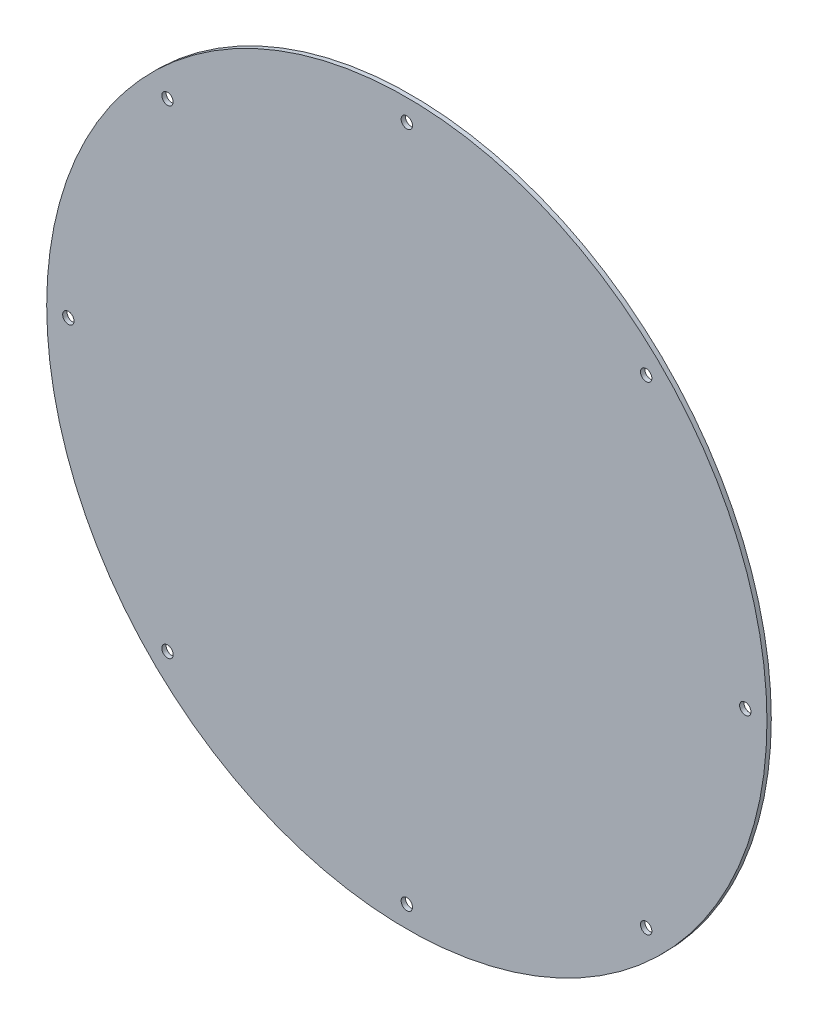
ISO-10303-21;
HEADER;
FILE_DESCRIPTION(('STEP AP214'),'2;1');
FILE_NAME('part.step','',(''),(''),'','','');
FILE_SCHEMA(('AUTOMOTIVE_DESIGN { 1 0 10303 214 1 1 1 1 }'));
ENDSEC;
DATA;
#1=APPLICATION_CONTEXT('core data for automotive mechanical design processes');
#2=APPLICATION_PROTOCOL_DEFINITION('international standard','automotive_design',2000,#1);
#3=PRODUCT_CONTEXT('',#1,'mechanical');
#4=PRODUCT('Part','Part','',(#3));
#5=PRODUCT_RELATED_PRODUCT_CATEGORY('part','',(#4));
#6=PRODUCT_DEFINITION_FORMATION('','',#4);
#7=PRODUCT_DEFINITION_CONTEXT('part definition',#1,'design');
#8=PRODUCT_DEFINITION('design','',#6,#7);
#9=PRODUCT_DEFINITION_SHAPE('','',#8);
#10=(LENGTH_UNIT() NAMED_UNIT(*) SI_UNIT(.MILLI.,.METRE.));
#11=(NAMED_UNIT(*) PLANE_ANGLE_UNIT() SI_UNIT($,.RADIAN.));
#12=(NAMED_UNIT(*) SI_UNIT($,.STERADIAN.) SOLID_ANGLE_UNIT());
#13=UNCERTAINTY_MEASURE_WITH_UNIT(LENGTH_MEASURE(1.E-05),#10,'distance_accuracy_value','');
#14=(GEOMETRIC_REPRESENTATION_CONTEXT(3) GLOBAL_UNCERTAINTY_ASSIGNED_CONTEXT((#13)) GLOBAL_UNIT_ASSIGNED_CONTEXT((#10,
#11,#12)) REPRESENTATION_CONTEXT('',''));
#15=CARTESIAN_POINT('',(0.,0.,0.));
#16=DIRECTION('',(0.,0.,1.));
#17=DIRECTION('',(1.,0.,0.));
#18=AXIS2_PLACEMENT_3D('',#15,#16,#17);
#19=CARTESIAN_POINT('',(0.,0.,1.6));
#20=DIRECTION('',(0.,0.,1.));
#21=DIRECTION('',(1.,0.,0.));
#22=AXIS2_PLACEMENT_3D('',#19,#20,#21);
#23=PLANE('',#22);
#24=CARTESIAN_POINT('',(-124.999999999991,-9.3819195673314E-12,1.6));
#25=DIRECTION('',(0.,0.,1.));
#26=DIRECTION('',(1.,0.,0.));
#27=AXIS2_PLACEMENT_3D('',#24,#25,#26);
#28=CIRCLE('',#27,2.1000000000128);
#29=CARTESIAN_POINT('',(-122.899999999978,-9.3819195673314E-12,1.6));
#30=VERTEX_POINT('',#29);
#31=EDGE_CURVE('E80',#30,#30,#28,.T.);
#32=ORIENTED_EDGE('',*,*,#31,.F.);
#33=EDGE_LOOP('',(#32));
#34=FACE_BOUND('',#33,.T.);
#35=CARTESIAN_POINT('',(1.87332229646841E-11,-125.,1.6));
#36=DIRECTION('',(0.,0.,1.));
#37=DIRECTION('',(1.,0.,0.));
#38=AXIS2_PLACEMENT_3D('',#35,#36,#37);
#39=CIRCLE('',#38,2.1000000000128);
#40=CARTESIAN_POINT('',(2.10000000003154,-125.,1.6));
#41=VERTEX_POINT('',#40);
#42=EDGE_CURVE('E68',#41,#41,#39,.T.);
#43=ORIENTED_EDGE('',*,*,#42,.F.);
#44=EDGE_LOOP('',(#43));
#45=FACE_BOUND('',#44,.T.);
#46=CARTESIAN_POINT('',(125.000000000009,9.36661148234206E-12,1.6));
#47=DIRECTION('',(0.,0.,1.));
#48=DIRECTION('',(1.,0.,0.));
#49=AXIS2_PLACEMENT_3D('',#46,#47,#48);
#50=CIRCLE('',#49,2.10000000001282);
#51=CARTESIAN_POINT('',(127.100000000022,9.36661148234206E-12,1.6));
#52=VERTEX_POINT('',#51);
#53=EDGE_CURVE('E56',#52,#52,#50,.T.);
#54=ORIENTED_EDGE('',*,*,#53,.F.);
#55=EDGE_LOOP('',(#54));
#56=FACE_BOUND('',#55,.T.);
#57=CARTESIAN_POINT('',(0.,125.,1.6));
#58=DIRECTION('',(0.,0.,1.));
#59=DIRECTION('',(1.,0.,0.));
#60=AXIS2_PLACEMENT_3D('',#57,#58,#59);
#61=CIRCLE('',#60,2.1000000000128);
#62=CARTESIAN_POINT('',(2.1000000000128,125.,1.6));
#63=VERTEX_POINT('',#62);
#64=EDGE_CURVE('E45',#63,#63,#61,.T.);
#65=ORIENTED_EDGE('',*,*,#64,.F.);
#66=EDGE_LOOP('',(#65));
#67=FACE_BOUND('',#66,.T.);
#68=CARTESIAN_POINT('',(0.,0.,1.6));
#69=DIRECTION('',(0.,0.,1.));
#70=DIRECTION('',(1.,0.,0.));
#71=AXIS2_PLACEMENT_3D('',#68,#69,#70);
#72=CIRCLE('',#71,133.);
#73=CARTESIAN_POINT('',(133.,0.,1.6));
#74=VERTEX_POINT('',#73);
#75=EDGE_CURVE('E10',#74,#74,#72,.T.);
#76=ORIENTED_EDGE('',*,*,#75,.T.);
#77=EDGE_LOOP('',(#76));
#78=FACE_BOUND('',#77,.T.);
#79=CARTESIAN_POINT('',(88.3883476483212,88.3883476483251,1.6));
#80=DIRECTION('',(0.,0.,1.));
#81=DIRECTION('',(1.,0.,0.));
#82=AXIS2_PLACEMENT_3D('',#79,#80,#81);
#83=CIRCLE('',#82,2.1000000000128);
#84=CARTESIAN_POINT('',(90.488347648334,88.3883476483251,1.6));
#85=VERTEX_POINT('',#84);
#86=EDGE_CURVE('E50',#85,#85,#83,.T.);
#87=ORIENTED_EDGE('',*,*,#86,.F.);
#88=EDGE_LOOP('',(#87));
#89=FACE_BOUND('',#88,.T.);
#90=CARTESIAN_POINT('',(88.3883476483344,-88.3883476483118,1.6));
#91=DIRECTION('',(0.,0.,1.));
#92=DIRECTION('',(1.,0.,0.));
#93=AXIS2_PLACEMENT_3D('',#90,#91,#92);
#94=CIRCLE('',#93,2.1000000000128);
#95=CARTESIAN_POINT('',(90.4883476483472,-88.3883476483118,1.6));
#96=VERTEX_POINT('',#95);
#97=EDGE_CURVE('E62',#96,#96,#94,.T.);
#98=ORIENTED_EDGE('',*,*,#97,.F.);
#99=EDGE_LOOP('',(#98));
#100=FACE_BOUND('',#99,.T.);
#101=CARTESIAN_POINT('',(-88.3883476483025,-88.3883476483251,1.6));
#102=DIRECTION('',(0.,0.,1.));
#103=DIRECTION('',(1.,0.,0.));
#104=AXIS2_PLACEMENT_3D('',#101,#102,#103);
#105=CIRCLE('',#104,2.1000000000128);
#106=CARTESIAN_POINT('',(-86.2883476482897,-88.3883476483251,1.6));
#107=VERTEX_POINT('',#106);
#108=EDGE_CURVE('E74',#107,#107,#105,.T.);
#109=ORIENTED_EDGE('',*,*,#108,.F.);
#110=EDGE_LOOP('',(#109));
#111=FACE_BOUND('',#110,.T.);
#112=CARTESIAN_POINT('',(-88.3883476483157,88.3883476483118,1.6));
#113=DIRECTION('',(0.,0.,1.));
#114=DIRECTION('',(1.,0.,0.));
#115=AXIS2_PLACEMENT_3D('',#112,#113,#114);
#116=CIRCLE('',#115,2.1000000000128);
#117=CARTESIAN_POINT('',(-86.2883476483029,88.3883476483118,1.6));
#118=VERTEX_POINT('',#117);
#119=EDGE_CURVE('E86',#118,#118,#116,.T.);
#120=ORIENTED_EDGE('',*,*,#119,.F.);
#121=EDGE_LOOP('',(#120));
#122=FACE_BOUND('',#121,.T.);
#123=ADVANCED_FACE('F34',(#34,#45,#56,#67,#78,#89,#100,#111,#122),#23,.T.);
#124=CARTESIAN_POINT('',(0.,0.,0.));
#125=DIRECTION('',(0.,0.,1.));
#126=DIRECTION('',(1.,0.,0.));
#127=AXIS2_PLACEMENT_3D('',#124,#125,#126);
#128=PLANE('',#127);
#129=CARTESIAN_POINT('',(0.,0.,0.));
#130=DIRECTION('',(0.,0.,1.));
#131=DIRECTION('',(1.,0.,0.));
#132=AXIS2_PLACEMENT_3D('',#129,#130,#131);
#133=CIRCLE('',#132,133.);
#134=CARTESIAN_POINT('',(133.,0.,0.));
#135=VERTEX_POINT('',#134);
#136=EDGE_CURVE('E38',#135,#135,#133,.T.);
#137=ORIENTED_EDGE('',*,*,#136,.F.);
#138=EDGE_LOOP('',(#137));
#139=FACE_BOUND('',#138,.T.);
#140=CARTESIAN_POINT('',(0.,125.,0.));
#141=DIRECTION('',(0.,0.,1.));
#142=DIRECTION('',(1.,0.,0.));
#143=AXIS2_PLACEMENT_3D('',#140,#141,#142);
#144=CIRCLE('',#143,2.1000000000128);
#145=CARTESIAN_POINT('',(2.1000000000128,125.,0.));
#146=VERTEX_POINT('',#145);
#147=EDGE_CURVE('E47',#146,#146,#144,.T.);
#148=ORIENTED_EDGE('',*,*,#147,.T.);
#149=EDGE_LOOP('',(#148));
#150=FACE_BOUND('',#149,.T.);
#151=CARTESIAN_POINT('',(88.3883476483212,88.3883476483251,0.));
#152=DIRECTION('',(0.,0.,1.));
#153=DIRECTION('',(1.,0.,0.));
#154=AXIS2_PLACEMENT_3D('',#151,#152,#153);
#155=CIRCLE('',#154,2.1000000000128);
#156=CARTESIAN_POINT('',(90.488347648334,88.3883476483251,0.));
#157=VERTEX_POINT('',#156);
#158=EDGE_CURVE('E53',#157,#157,#155,.T.);
#159=ORIENTED_EDGE('',*,*,#158,.T.);
#160=EDGE_LOOP('',(#159));
#161=FACE_BOUND('',#160,.T.);
#162=CARTESIAN_POINT('',(125.000000000009,9.36661148234206E-12,0.));
#163=DIRECTION('',(0.,0.,1.));
#164=DIRECTION('',(1.,0.,0.));
#165=AXIS2_PLACEMENT_3D('',#162,#163,#164);
#166=CIRCLE('',#165,2.10000000001282);
#167=CARTESIAN_POINT('',(127.100000000022,9.36661148234206E-12,0.));
#168=VERTEX_POINT('',#167);
#169=EDGE_CURVE('E59',#168,#168,#166,.T.);
#170=ORIENTED_EDGE('',*,*,#169,.T.);
#171=EDGE_LOOP('',(#170));
#172=FACE_BOUND('',#171,.T.);
#173=CARTESIAN_POINT('',(88.3883476483344,-88.3883476483118,0.));
#174=DIRECTION('',(0.,0.,1.));
#175=DIRECTION('',(1.,0.,0.));
#176=AXIS2_PLACEMENT_3D('',#173,#174,#175);
#177=CIRCLE('',#176,2.1000000000128);
#178=CARTESIAN_POINT('',(90.4883476483472,-88.3883476483118,0.));
#179=VERTEX_POINT('',#178);
#180=EDGE_CURVE('E65',#179,#179,#177,.T.);
#181=ORIENTED_EDGE('',*,*,#180,.T.);
#182=EDGE_LOOP('',(#181));
#183=FACE_BOUND('',#182,.T.);
#184=CARTESIAN_POINT('',(1.87332229646841E-11,-125.,0.));
#185=DIRECTION('',(0.,0.,1.));
#186=DIRECTION('',(1.,0.,0.));
#187=AXIS2_PLACEMENT_3D('',#184,#185,#186);
#188=CIRCLE('',#187,2.1000000000128);
#189=CARTESIAN_POINT('',(2.10000000003154,-125.,0.));
#190=VERTEX_POINT('',#189);
#191=EDGE_CURVE('E71',#190,#190,#188,.T.);
#192=ORIENTED_EDGE('',*,*,#191,.T.);
#193=EDGE_LOOP('',(#192));
#194=FACE_BOUND('',#193,.T.);
#195=CARTESIAN_POINT('',(-88.3883476483025,-88.3883476483251,0.));
#196=DIRECTION('',(0.,0.,1.));
#197=DIRECTION('',(1.,0.,0.));
#198=AXIS2_PLACEMENT_3D('',#195,#196,#197);
#199=CIRCLE('',#198,2.1000000000128);
#200=CARTESIAN_POINT('',(-86.2883476482897,-88.3883476483251,0.));
#201=VERTEX_POINT('',#200);
#202=EDGE_CURVE('E77',#201,#201,#199,.T.);
#203=ORIENTED_EDGE('',*,*,#202,.T.);
#204=EDGE_LOOP('',(#203));
#205=FACE_BOUND('',#204,.T.);
#206=CARTESIAN_POINT('',(-124.999999999991,-9.3819195673314E-12,0.));
#207=DIRECTION('',(0.,0.,1.));
#208=DIRECTION('',(1.,0.,0.));
#209=AXIS2_PLACEMENT_3D('',#206,#207,#208);
#210=CIRCLE('',#209,2.1000000000128);
#211=CARTESIAN_POINT('',(-122.899999999978,-9.3819195673314E-12,0.));
#212=VERTEX_POINT('',#211);
#213=EDGE_CURVE('E83',#212,#212,#210,.T.);
#214=ORIENTED_EDGE('',*,*,#213,.T.);
#215=EDGE_LOOP('',(#214));
#216=FACE_BOUND('',#215,.T.);
#217=CARTESIAN_POINT('',(-88.3883476483157,88.3883476483118,0.));
#218=DIRECTION('',(0.,0.,1.));
#219=DIRECTION('',(1.,0.,0.));
#220=AXIS2_PLACEMENT_3D('',#217,#218,#219);
#221=CIRCLE('',#220,2.1000000000128);
#222=CARTESIAN_POINT('',(-86.2883476483029,88.3883476483118,0.));
#223=VERTEX_POINT('',#222);
#224=EDGE_CURVE('E89',#223,#223,#221,.T.);
#225=ORIENTED_EDGE('',*,*,#224,.T.);
#226=EDGE_LOOP('',(#225));
#227=FACE_BOUND('',#226,.T.);
#228=ADVANCED_FACE('F99',(#139,#150,#161,#172,#183,#194,#205,#216,#227),#128,.F.);
#229=CARTESIAN_POINT('',(0.,0.,1.6));
#230=DIRECTION('',(0.,0.,-1.));
#231=DIRECTION('',(-1.,0.,0.));
#232=AXIS2_PLACEMENT_3D('',#229,#230,#231);
#233=CYLINDRICAL_SURFACE('',#232,133.);
#234=ORIENTED_EDGE('',*,*,#75,.F.);
#235=EDGE_LOOP('',(#234));
#236=FACE_BOUND('',#235,.T.);
#237=ORIENTED_EDGE('',*,*,#136,.T.);
#238=EDGE_LOOP('',(#237));
#239=FACE_BOUND('',#238,.T.);
#240=ADVANCED_FACE('F36',(#236,#239),#233,.T.);
#241=CARTESIAN_POINT('',(0.,125.,1.6));
#242=DIRECTION('',(0.,0.,-1.));
#243=DIRECTION('',(-1.,0.,0.));
#244=AXIS2_PLACEMENT_3D('',#241,#242,#243);
#245=CYLINDRICAL_SURFACE('',#244,2.1000000000128);
#246=ORIENTED_EDGE('',*,*,#64,.T.);
#247=EDGE_LOOP('',(#246));
#248=FACE_BOUND('',#247,.T.);
#249=ORIENTED_EDGE('',*,*,#147,.F.);
#250=EDGE_LOOP('',(#249));
#251=FACE_BOUND('',#250,.T.);
#252=ADVANCED_FACE('F109',(#248,#251),#245,.F.);
#253=CARTESIAN_POINT('',(88.3883476483212,88.3883476483251,1.6));
#254=DIRECTION('',(0.,0.,-1.));
#255=DIRECTION('',(-1.,0.,0.));
#256=AXIS2_PLACEMENT_3D('',#253,#254,#255);
#257=CYLINDRICAL_SURFACE('',#256,2.1000000000128);
#258=ORIENTED_EDGE('',*,*,#86,.T.);
#259=EDGE_LOOP('',(#258));
#260=FACE_BOUND('',#259,.T.);
#261=ORIENTED_EDGE('',*,*,#158,.F.);
#262=EDGE_LOOP('',(#261));
#263=FACE_BOUND('',#262,.T.);
#264=ADVANCED_FACE('F112',(#260,#263),#257,.F.);
#265=CARTESIAN_POINT('',(125.000000000009,9.36661148234206E-12,1.6));
#266=DIRECTION('',(0.,0.,-1.));
#267=DIRECTION('',(-1.,0.,0.));
#268=AXIS2_PLACEMENT_3D('',#265,#266,#267);
#269=CYLINDRICAL_SURFACE('',#268,2.10000000001282);
#270=ORIENTED_EDGE('',*,*,#53,.T.);
#271=EDGE_LOOP('',(#270));
#272=FACE_BOUND('',#271,.T.);
#273=ORIENTED_EDGE('',*,*,#169,.F.);
#274=EDGE_LOOP('',(#273));
#275=FACE_BOUND('',#274,.T.);
#276=ADVANCED_FACE('F116',(#272,#275),#269,.F.);
#277=CARTESIAN_POINT('',(88.3883476483344,-88.3883476483118,1.6));
#278=DIRECTION('',(0.,0.,-1.));
#279=DIRECTION('',(-1.,0.,0.));
#280=AXIS2_PLACEMENT_3D('',#277,#278,#279);
#281=CYLINDRICAL_SURFACE('',#280,2.1000000000128);
#282=ORIENTED_EDGE('',*,*,#97,.T.);
#283=EDGE_LOOP('',(#282));
#284=FACE_BOUND('',#283,.T.);
#285=ORIENTED_EDGE('',*,*,#180,.F.);
#286=EDGE_LOOP('',(#285));
#287=FACE_BOUND('',#286,.T.);
#288=ADVANCED_FACE('F120',(#284,#287),#281,.F.);
#289=CARTESIAN_POINT('',(1.87332229646841E-11,-125.,1.6));
#290=DIRECTION('',(0.,0.,-1.));
#291=DIRECTION('',(-1.,0.,0.));
#292=AXIS2_PLACEMENT_3D('',#289,#290,#291);
#293=CYLINDRICAL_SURFACE('',#292,2.1000000000128);
#294=ORIENTED_EDGE('',*,*,#42,.T.);
#295=EDGE_LOOP('',(#294));
#296=FACE_BOUND('',#295,.T.);
#297=ORIENTED_EDGE('',*,*,#191,.F.);
#298=EDGE_LOOP('',(#297));
#299=FACE_BOUND('',#298,.T.);
#300=ADVANCED_FACE('F124',(#296,#299),#293,.F.);
#301=CARTESIAN_POINT('',(-88.3883476483025,-88.3883476483251,1.6));
#302=DIRECTION('',(0.,0.,-1.));
#303=DIRECTION('',(-1.,0.,0.));
#304=AXIS2_PLACEMENT_3D('',#301,#302,#303);
#305=CYLINDRICAL_SURFACE('',#304,2.1000000000128);
#306=ORIENTED_EDGE('',*,*,#108,.T.);
#307=EDGE_LOOP('',(#306));
#308=FACE_BOUND('',#307,.T.);
#309=ORIENTED_EDGE('',*,*,#202,.F.);
#310=EDGE_LOOP('',(#309));
#311=FACE_BOUND('',#310,.T.);
#312=ADVANCED_FACE('F128',(#308,#311),#305,.F.);
#313=CARTESIAN_POINT('',(-124.999999999991,-9.3819195673314E-12,1.6));
#314=DIRECTION('',(0.,0.,-1.));
#315=DIRECTION('',(-1.,0.,0.));
#316=AXIS2_PLACEMENT_3D('',#313,#314,#315);
#317=CYLINDRICAL_SURFACE('',#316,2.1000000000128);
#318=ORIENTED_EDGE('',*,*,#31,.T.);
#319=EDGE_LOOP('',(#318));
#320=FACE_BOUND('',#319,.T.);
#321=ORIENTED_EDGE('',*,*,#213,.F.);
#322=EDGE_LOOP('',(#321));
#323=FACE_BOUND('',#322,.T.);
#324=ADVANCED_FACE('F132',(#320,#323),#317,.F.);
#325=CARTESIAN_POINT('',(-88.3883476483157,88.3883476483118,1.6));
#326=DIRECTION('',(0.,0.,-1.));
#327=DIRECTION('',(-1.,0.,0.));
#328=AXIS2_PLACEMENT_3D('',#325,#326,#327);
#329=CYLINDRICAL_SURFACE('',#328,2.1000000000128);
#330=ORIENTED_EDGE('',*,*,#119,.T.);
#331=EDGE_LOOP('',(#330));
#332=FACE_BOUND('',#331,.T.);
#333=ORIENTED_EDGE('',*,*,#224,.F.);
#334=EDGE_LOOP('',(#333));
#335=FACE_BOUND('',#334,.T.);
#336=ADVANCED_FACE('F95',(#332,#335),#329,.F.);
#337=CLOSED_SHELL('',(#123,#228,#240,#252,#264,#276,#288,#300,#312,#324,#336));
#338=MANIFOLD_SOLID_BREP('B2',#337);
#339=ADVANCED_BREP_SHAPE_REPRESENTATION('',(#18,#338),#14);
#340=SHAPE_DEFINITION_REPRESENTATION(#9,#339);
ENDSEC;
END-ISO-10303-21;
